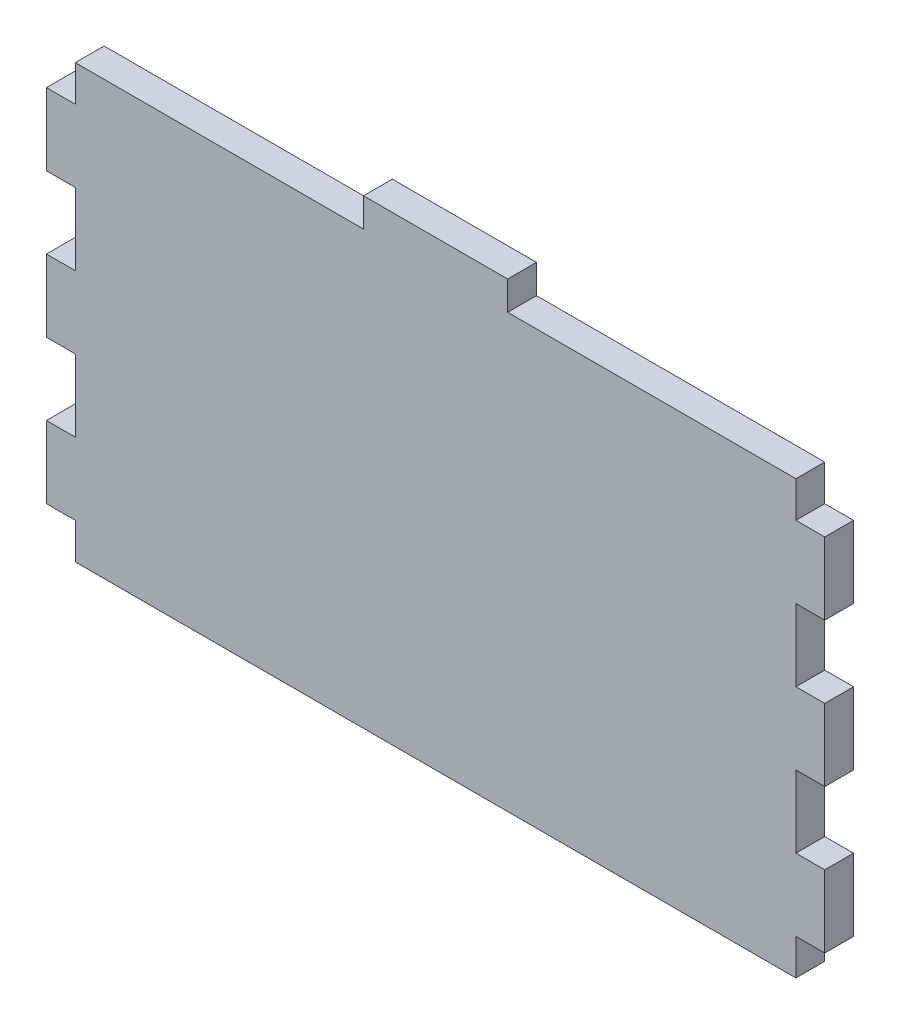
ISO-10303-21;
HEADER;
FILE_DESCRIPTION(('STEP AP214'),'2;1');
FILE_NAME('part.step','',(''),(''),'','','');
FILE_SCHEMA(('AUTOMOTIVE_DESIGN { 1 0 10303 214 1 1 1 1 }'));
ENDSEC;
DATA;
#1=APPLICATION_CONTEXT('core data for automotive mechanical design processes');
#2=APPLICATION_PROTOCOL_DEFINITION('international standard','automotive_design',2000,#1);
#3=PRODUCT_CONTEXT('',#1,'mechanical');
#4=PRODUCT('Part','Part','',(#3));
#5=PRODUCT_RELATED_PRODUCT_CATEGORY('part','',(#4));
#6=PRODUCT_DEFINITION_FORMATION('','',#4);
#7=PRODUCT_DEFINITION_CONTEXT('part definition',#1,'design');
#8=PRODUCT_DEFINITION('design','',#6,#7);
#9=PRODUCT_DEFINITION_SHAPE('','',#8);
#10=(LENGTH_UNIT() NAMED_UNIT(*) SI_UNIT(.MILLI.,.METRE.));
#11=(NAMED_UNIT(*) PLANE_ANGLE_UNIT() SI_UNIT($,.RADIAN.));
#12=(NAMED_UNIT(*) SI_UNIT($,.STERADIAN.) SOLID_ANGLE_UNIT());
#13=UNCERTAINTY_MEASURE_WITH_UNIT(LENGTH_MEASURE(1.E-05),#10,'distance_accuracy_value','');
#14=(GEOMETRIC_REPRESENTATION_CONTEXT(3) GLOBAL_UNCERTAINTY_ASSIGNED_CONTEXT((#13)) GLOBAL_UNIT_ASSIGNED_CONTEXT((#10,
#11,#12)) REPRESENTATION_CONTEXT('',''));
#15=CARTESIAN_POINT('',(0.,0.,0.));
#16=DIRECTION('',(0.,0.,1.));
#17=DIRECTION('',(1.,0.,0.));
#18=AXIS2_PLACEMENT_3D('',#15,#16,#17);
#19=CARTESIAN_POINT('',(0.,30.,4.));
#20=DIRECTION('',(0.,1.,0.));
#21=DIRECTION('',(0.,0.,1.));
#22=AXIS2_PLACEMENT_3D('',#19,#20,#21);
#23=PLANE('',#22);
#24=DIRECTION('',(0.,0.,-1.));
#25=VECTOR('',#24,1.);
#26=CARTESIAN_POINT('',(10.,30.,4.));
#27=LINE('',#26,#25);
#28=CARTESIAN_POINT('',(10.,30.,4.));
#29=VERTEX_POINT('',#28);
#30=CARTESIAN_POINT('',(10.,30.,0.));
#31=VERTEX_POINT('',#30);
#32=EDGE_CURVE('E258',#29,#31,#27,.T.);
#33=ORIENTED_EDGE('',*,*,#32,.F.);
#34=DIRECTION('',(1.,0.,0.));
#35=VECTOR('',#34,1.);
#36=CARTESIAN_POINT('',(0.,30.,4.));
#37=LINE('',#36,#35);
#38=CARTESIAN_POINT('',(50.,30.,4.));
#39=VERTEX_POINT('',#38);
#40=EDGE_CURVE('E343',#29,#39,#37,.T.);
#41=ORIENTED_EDGE('',*,*,#40,.T.);
#42=DIRECTION('',(0.,0.,-1.));
#43=VECTOR('',#42,1.);
#44=CARTESIAN_POINT('',(50.,30.,4.));
#45=LINE('',#44,#43);
#46=CARTESIAN_POINT('',(50.,30.,0.));
#47=VERTEX_POINT('',#46);
#48=EDGE_CURVE('E519',#39,#47,#45,.T.);
#49=ORIENTED_EDGE('',*,*,#48,.T.);
#50=DIRECTION('',(1.,0.,0.));
#51=VECTOR('',#50,1.);
#52=CARTESIAN_POINT('',(0.,30.,0.));
#53=LINE('',#52,#51);
#54=EDGE_CURVE('E65',#31,#47,#53,.T.);
#55=ORIENTED_EDGE('',*,*,#54,.F.);
#56=EDGE_LOOP('',(#33,#41,#49,#55));
#57=FACE_BOUND('',#56,.T.);
#58=ADVANCED_FACE('F41',(#57),#23,.T.);
#59=CARTESIAN_POINT('',(50.,0.,4.));
#60=DIRECTION('',(-1.,0.,0.));
#61=DIRECTION('',(0.,0.,1.));
#62=AXIS2_PLACEMENT_3D('',#59,#60,#61);
#63=PLANE('',#62);
#64=DIRECTION('',(0.,1.,0.));
#65=VECTOR('',#64,1.);
#66=CARTESIAN_POINT('',(50.,0.,0.));
#67=LINE('',#66,#65);
#68=CARTESIAN_POINT('',(50.,-30.,0.));
#69=VERTEX_POINT('',#68);
#70=CARTESIAN_POINT('',(50.,-25.,0.));
#71=VERTEX_POINT('',#70);
#72=EDGE_CURVE('E298',#69,#71,#67,.T.);
#73=ORIENTED_EDGE('',*,*,#72,.T.);
#74=DIRECTION('',(0.,0.,-1.));
#75=VECTOR('',#74,1.);
#76=CARTESIAN_POINT('',(50.,-25.,4.));
#77=LINE('',#76,#75);
#78=CARTESIAN_POINT('',(50.,-25.,4.));
#79=VERTEX_POINT('',#78);
#80=EDGE_CURVE('E11',#79,#71,#77,.T.);
#81=ORIENTED_EDGE('',*,*,#80,.F.);
#82=DIRECTION('',(0.,1.,0.));
#83=VECTOR('',#82,1.);
#84=CARTESIAN_POINT('',(50.,0.,4.));
#85=LINE('',#84,#83);
#86=CARTESIAN_POINT('',(50.,-30.,4.));
#87=VERTEX_POINT('',#86);
#88=EDGE_CURVE('E299',#87,#79,#85,.T.);
#89=ORIENTED_EDGE('',*,*,#88,.F.);
#90=DIRECTION('',(0.,0.,-1.));
#91=VECTOR('',#90,1.);
#92=CARTESIAN_POINT('',(50.,-30.,4.));
#93=LINE('',#92,#91);
#94=EDGE_CURVE('E383',#87,#69,#93,.T.);
#95=ORIENTED_EDGE('',*,*,#94,.T.);
#96=EDGE_LOOP('',(#73,#81,#89,#95));
#97=FACE_BOUND('',#96,.T.);
#98=ADVANCED_FACE('F576',(#97),#63,.F.);
#99=CARTESIAN_POINT('',(0.,-25.,4.));
#100=DIRECTION('',(0.,1.,0.));
#101=DIRECTION('',(0.,0.,1.));
#102=AXIS2_PLACEMENT_3D('',#99,#100,#101);
#103=PLANE('',#102);
#104=DIRECTION('',(1.,0.,0.));
#105=VECTOR('',#104,1.);
#106=CARTESIAN_POINT('',(0.,-25.,0.));
#107=LINE('',#106,#105);
#108=CARTESIAN_POINT('',(54.,-25.,0.));
#109=VERTEX_POINT('',#108);
#110=EDGE_CURVE('E387',#71,#109,#107,.T.);
#111=ORIENTED_EDGE('',*,*,#110,.T.);
#112=DIRECTION('',(0.,0.,-1.));
#113=VECTOR('',#112,1.);
#114=CARTESIAN_POINT('',(54.,-25.,4.));
#115=LINE('',#114,#113);
#116=CARTESIAN_POINT('',(54.,-25.,4.));
#117=VERTEX_POINT('',#116);
#118=EDGE_CURVE('E50',#117,#109,#115,.T.);
#119=ORIENTED_EDGE('',*,*,#118,.F.);
#120=DIRECTION('',(1.,0.,0.));
#121=VECTOR('',#120,1.);
#122=CARTESIAN_POINT('',(0.,-25.,4.));
#123=LINE('',#122,#121);
#124=EDGE_CURVE('E303',#79,#117,#123,.T.);
#125=ORIENTED_EDGE('',*,*,#124,.F.);
#126=ORIENTED_EDGE('',*,*,#80,.T.);
#127=EDGE_LOOP('',(#111,#119,#125,#126));
#128=FACE_BOUND('',#127,.T.);
#129=ADVANCED_FACE('F43',(#128),#103,.F.);
#130=CARTESIAN_POINT('',(54.,0.,4.));
#131=DIRECTION('',(1.,0.,0.));
#132=DIRECTION('',(0.,0.,-1.));
#133=AXIS2_PLACEMENT_3D('',#130,#131,#132);
#134=PLANE('',#133);
#135=DIRECTION('',(0.,-1.,0.));
#136=VECTOR('',#135,1.);
#137=CARTESIAN_POINT('',(54.,0.,0.));
#138=LINE('',#137,#136);
#139=CARTESIAN_POINT('',(54.,-15.,0.));
#140=VERTEX_POINT('',#139);
#141=EDGE_CURVE('E393',#140,#109,#138,.T.);
#142=ORIENTED_EDGE('',*,*,#141,.F.);
#143=DIRECTION('',(0.,0.,-1.));
#144=VECTOR('',#143,1.);
#145=CARTESIAN_POINT('',(54.,-15.,4.));
#146=LINE('',#145,#144);
#147=CARTESIAN_POINT('',(54.,-15.,4.));
#148=VERTEX_POINT('',#147);
#149=EDGE_CURVE('E551',#148,#140,#146,.T.);
#150=ORIENTED_EDGE('',*,*,#149,.F.);
#151=DIRECTION('',(0.,-1.,0.));
#152=VECTOR('',#151,1.);
#153=CARTESIAN_POINT('',(54.,0.,4.));
#154=LINE('',#153,#152);
#155=EDGE_CURVE('E309',#148,#117,#154,.T.);
#156=ORIENTED_EDGE('',*,*,#155,.T.);
#157=ORIENTED_EDGE('',*,*,#118,.T.);
#158=EDGE_LOOP('',(#142,#150,#156,#157));
#159=FACE_BOUND('',#158,.T.);
#160=ADVANCED_FACE('F557',(#159),#134,.T.);
#161=CARTESIAN_POINT('',(0.,-15.,4.));
#162=DIRECTION('',(0.,1.,0.));
#163=DIRECTION('',(0.,0.,1.));
#164=AXIS2_PLACEMENT_3D('',#161,#162,#163);
#165=PLANE('',#164);
#166=DIRECTION('',(1.,0.,0.));
#167=VECTOR('',#166,1.);
#168=CARTESIAN_POINT('',(0.,-15.,0.));
#169=LINE('',#168,#167);
#170=CARTESIAN_POINT('',(50.,-15.,0.));
#171=VERTEX_POINT('',#170);
#172=EDGE_CURVE('E397',#171,#140,#169,.T.);
#173=ORIENTED_EDGE('',*,*,#172,.F.);
#174=DIRECTION('',(0.,0.,-1.));
#175=VECTOR('',#174,1.);
#176=CARTESIAN_POINT('',(50.,-15.,4.));
#177=LINE('',#176,#175);
#178=CARTESIAN_POINT('',(50.,-15.,4.));
#179=VERTEX_POINT('',#178);
#180=EDGE_CURVE('E548',#179,#171,#177,.T.);
#181=ORIENTED_EDGE('',*,*,#180,.F.);
#182=DIRECTION('',(1.,0.,0.));
#183=VECTOR('',#182,1.);
#184=CARTESIAN_POINT('',(0.,-15.,4.));
#185=LINE('',#184,#183);
#186=EDGE_CURVE('E313',#179,#148,#185,.T.);
#187=ORIENTED_EDGE('',*,*,#186,.T.);
#188=ORIENTED_EDGE('',*,*,#149,.T.);
#189=EDGE_LOOP('',(#173,#181,#187,#188));
#190=FACE_BOUND('',#189,.T.);
#191=ADVANCED_FACE('F566',(#190),#165,.T.);
#192=CARTESIAN_POINT('',(50.,-5.,0.));
#193=VERTEX_POINT('',#192);
#194=EDGE_CURVE('E389',#171,#193,#67,.T.);
#195=ORIENTED_EDGE('',*,*,#194,.T.);
#196=DIRECTION('',(0.,0.,-1.));
#197=VECTOR('',#196,1.);
#198=CARTESIAN_POINT('',(50.,-5.,4.));
#199=LINE('',#198,#197);
#200=CARTESIAN_POINT('',(50.,-5.,4.));
#201=VERTEX_POINT('',#200);
#202=EDGE_CURVE('E544',#201,#193,#199,.T.);
#203=ORIENTED_EDGE('',*,*,#202,.F.);
#204=EDGE_CURVE('E306',#179,#201,#85,.T.);
#205=ORIENTED_EDGE('',*,*,#204,.F.);
#206=ORIENTED_EDGE('',*,*,#180,.T.);
#207=EDGE_LOOP('',(#195,#203,#205,#206));
#208=FACE_BOUND('',#207,.T.);
#209=ADVANCED_FACE('F634',(#208),#63,.F.);
#210=CARTESIAN_POINT('',(0.,-5.,4.));
#211=DIRECTION('',(0.,1.,0.));
#212=DIRECTION('',(0.,0.,1.));
#213=AXIS2_PLACEMENT_3D('',#210,#211,#212);
#214=PLANE('',#213);
#215=DIRECTION('',(1.,0.,0.));
#216=VECTOR('',#215,1.);
#217=CARTESIAN_POINT('',(0.,-5.,0.));
#218=LINE('',#217,#216);
#219=CARTESIAN_POINT('',(54.,-5.,0.));
#220=VERTEX_POINT('',#219);
#221=EDGE_CURVE('E401',#193,#220,#218,.T.);
#222=ORIENTED_EDGE('',*,*,#221,.T.);
#223=DIRECTION('',(0.,0.,-1.));
#224=VECTOR('',#223,1.);
#225=CARTESIAN_POINT('',(54.,-5.,4.));
#226=LINE('',#225,#224);
#227=CARTESIAN_POINT('',(54.,-5.,4.));
#228=VERTEX_POINT('',#227);
#229=EDGE_CURVE('E541',#228,#220,#226,.T.);
#230=ORIENTED_EDGE('',*,*,#229,.F.);
#231=DIRECTION('',(1.,0.,0.));
#232=VECTOR('',#231,1.);
#233=CARTESIAN_POINT('',(0.,-5.,4.));
#234=LINE('',#233,#232);
#235=EDGE_CURVE('E317',#201,#228,#234,.T.);
#236=ORIENTED_EDGE('',*,*,#235,.F.);
#237=ORIENTED_EDGE('',*,*,#202,.T.);
#238=EDGE_LOOP('',(#222,#230,#236,#237));
#239=FACE_BOUND('',#238,.T.);
#240=ADVANCED_FACE('F667',(#239),#214,.F.);
#241=CARTESIAN_POINT('',(54.,0.,4.));
#242=DIRECTION('',(1.,0.,0.));
#243=DIRECTION('',(0.,0.,-1.));
#244=AXIS2_PLACEMENT_3D('',#241,#242,#243);
#245=PLANE('',#244);
#246=DIRECTION('',(0.,-1.,0.));
#247=VECTOR('',#246,1.);
#248=CARTESIAN_POINT('',(54.,0.,0.));
#249=LINE('',#248,#247);
#250=CARTESIAN_POINT('',(54.,5.,0.));
#251=VERTEX_POINT('',#250);
#252=EDGE_CURVE('E405',#251,#220,#249,.T.);
#253=ORIENTED_EDGE('',*,*,#252,.F.);
#254=DIRECTION('',(0.,0.,-1.));
#255=VECTOR('',#254,1.);
#256=CARTESIAN_POINT('',(54.,5.,4.));
#257=LINE('',#256,#255);
#258=CARTESIAN_POINT('',(54.,5.,4.));
#259=VERTEX_POINT('',#258);
#260=EDGE_CURVE('E538',#259,#251,#257,.T.);
#261=ORIENTED_EDGE('',*,*,#260,.F.);
#262=DIRECTION('',(0.,-1.,0.));
#263=VECTOR('',#262,1.);
#264=CARTESIAN_POINT('',(54.,0.,4.));
#265=LINE('',#264,#263);
#266=EDGE_CURVE('E320',#259,#228,#265,.T.);
#267=ORIENTED_EDGE('',*,*,#266,.T.);
#268=ORIENTED_EDGE('',*,*,#229,.T.);
#269=EDGE_LOOP('',(#253,#261,#267,#268));
#270=FACE_BOUND('',#269,.T.);
#271=ADVANCED_FACE('F663',(#270),#245,.T.);
#272=CARTESIAN_POINT('',(0.,5.,4.));
#273=DIRECTION('',(0.,1.,0.));
#274=DIRECTION('',(0.,0.,1.));
#275=AXIS2_PLACEMENT_3D('',#272,#273,#274);
#276=PLANE('',#275);
#277=DIRECTION('',(1.,0.,0.));
#278=VECTOR('',#277,1.);
#279=CARTESIAN_POINT('',(0.,5.,0.));
#280=LINE('',#279,#278);
#281=CARTESIAN_POINT('',(50.,5.,0.));
#282=VERTEX_POINT('',#281);
#283=EDGE_CURVE('E409',#282,#251,#280,.T.);
#284=ORIENTED_EDGE('',*,*,#283,.F.);
#285=DIRECTION('',(0.,0.,-1.));
#286=VECTOR('',#285,1.);
#287=CARTESIAN_POINT('',(50.,5.,4.));
#288=LINE('',#287,#286);
#289=CARTESIAN_POINT('',(50.,5.,4.));
#290=VERTEX_POINT('',#289);
#291=EDGE_CURVE('E535',#290,#282,#288,.T.);
#292=ORIENTED_EDGE('',*,*,#291,.F.);
#293=DIRECTION('',(1.,0.,0.));
#294=VECTOR('',#293,1.);
#295=CARTESIAN_POINT('',(0.,5.,4.));
#296=LINE('',#295,#294);
#297=EDGE_CURVE('E324',#290,#259,#296,.T.);
#298=ORIENTED_EDGE('',*,*,#297,.T.);
#299=ORIENTED_EDGE('',*,*,#260,.T.);
#300=EDGE_LOOP('',(#284,#292,#298,#299));
#301=FACE_BOUND('',#300,.T.);
#302=ADVANCED_FACE('F655',(#301),#276,.T.);
#303=CARTESIAN_POINT('',(50.,15.,0.));
#304=VERTEX_POINT('',#303);
#305=EDGE_CURVE('E413',#282,#304,#67,.T.);
#306=ORIENTED_EDGE('',*,*,#305,.T.);
#307=DIRECTION('',(0.,0.,-1.));
#308=VECTOR('',#307,1.);
#309=CARTESIAN_POINT('',(50.,15.,4.));
#310=LINE('',#309,#308);
#311=CARTESIAN_POINT('',(50.,15.,4.));
#312=VERTEX_POINT('',#311);
#313=EDGE_CURVE('E531',#312,#304,#310,.T.);
#314=ORIENTED_EDGE('',*,*,#313,.F.);
#315=EDGE_CURVE('E328',#290,#312,#85,.T.);
#316=ORIENTED_EDGE('',*,*,#315,.F.);
#317=ORIENTED_EDGE('',*,*,#291,.T.);
#318=EDGE_LOOP('',(#306,#314,#316,#317));
#319=FACE_BOUND('',#318,.T.);
#320=ADVANCED_FACE('F645',(#319),#63,.F.);
#321=CARTESIAN_POINT('',(0.,15.,4.));
#322=DIRECTION('',(0.,1.,0.));
#323=DIRECTION('',(-1.,0.,0.));
#324=AXIS2_PLACEMENT_3D('',#321,#322,#323);
#325=PLANE('',#324);
#326=DIRECTION('',(1.,0.,0.));
#327=VECTOR('',#326,1.);
#328=CARTESIAN_POINT('',(0.,15.,0.));
#329=LINE('',#328,#327);
#330=CARTESIAN_POINT('',(54.,15.,0.));
#331=VERTEX_POINT('',#330);
#332=EDGE_CURVE('E414',#304,#331,#329,.T.);
#333=ORIENTED_EDGE('',*,*,#332,.T.);
#334=DIRECTION('',(0.,0.,-1.));
#335=VECTOR('',#334,1.);
#336=CARTESIAN_POINT('',(54.,15.,4.));
#337=LINE('',#336,#335);
#338=CARTESIAN_POINT('',(54.,15.,4.));
#339=VERTEX_POINT('',#338);
#340=EDGE_CURVE('E528',#339,#331,#337,.T.);
#341=ORIENTED_EDGE('',*,*,#340,.F.);
#342=DIRECTION('',(1.,0.,0.));
#343=VECTOR('',#342,1.);
#344=CARTESIAN_POINT('',(0.,15.,4.));
#345=LINE('',#344,#343);
#346=EDGE_CURVE('E329',#312,#339,#345,.T.);
#347=ORIENTED_EDGE('',*,*,#346,.F.);
#348=ORIENTED_EDGE('',*,*,#313,.T.);
#349=EDGE_LOOP('',(#333,#341,#347,#348));
#350=FACE_BOUND('',#349,.T.);
#351=ADVANCED_FACE('F654',(#350),#325,.F.);
#352=CARTESIAN_POINT('',(54.,0.,4.));
#353=DIRECTION('',(1.,0.,0.));
#354=DIRECTION('',(0.,0.,-1.));
#355=AXIS2_PLACEMENT_3D('',#352,#353,#354);
#356=PLANE('',#355);
#357=DIRECTION('',(0.,-1.,0.));
#358=VECTOR('',#357,1.);
#359=CARTESIAN_POINT('',(54.,0.,0.));
#360=LINE('',#359,#358);
#361=CARTESIAN_POINT('',(54.,25.,0.));
#362=VERTEX_POINT('',#361);
#363=EDGE_CURVE('E418',#362,#331,#360,.T.);
#364=ORIENTED_EDGE('',*,*,#363,.F.);
#365=DIRECTION('',(0.,0.,-1.));
#366=VECTOR('',#365,1.);
#367=CARTESIAN_POINT('',(54.,25.,4.));
#368=LINE('',#367,#366);
#369=CARTESIAN_POINT('',(54.,25.,4.));
#370=VERTEX_POINT('',#369);
#371=EDGE_CURVE('E525',#370,#362,#368,.T.);
#372=ORIENTED_EDGE('',*,*,#371,.F.);
#373=DIRECTION('',(0.,-1.,0.));
#374=VECTOR('',#373,1.);
#375=CARTESIAN_POINT('',(54.,0.,4.));
#376=LINE('',#375,#374);
#377=EDGE_CURVE('E332',#370,#339,#376,.T.);
#378=ORIENTED_EDGE('',*,*,#377,.T.);
#379=ORIENTED_EDGE('',*,*,#340,.T.);
#380=EDGE_LOOP('',(#364,#372,#378,#379));
#381=FACE_BOUND('',#380,.T.);
#382=ADVANCED_FACE('F649',(#381),#356,.T.);
#383=CARTESIAN_POINT('',(0.,25.,4.));
#384=DIRECTION('',(0.,1.,0.));
#385=DIRECTION('',(0.,0.,1.));
#386=AXIS2_PLACEMENT_3D('',#383,#384,#385);
#387=PLANE('',#386);
#388=DIRECTION('',(1.,0.,0.));
#389=VECTOR('',#388,1.);
#390=CARTESIAN_POINT('',(0.,25.,0.));
#391=LINE('',#390,#389);
#392=CARTESIAN_POINT('',(50.,25.,0.));
#393=VERTEX_POINT('',#392);
#394=EDGE_CURVE('E422',#393,#362,#391,.T.);
#395=ORIENTED_EDGE('',*,*,#394,.F.);
#396=DIRECTION('',(0.,0.,-1.));
#397=VECTOR('',#396,1.);
#398=CARTESIAN_POINT('',(50.,25.,4.));
#399=LINE('',#398,#397);
#400=CARTESIAN_POINT('',(50.,25.,4.));
#401=VERTEX_POINT('',#400);
#402=EDGE_CURVE('E522',#401,#393,#399,.T.);
#403=ORIENTED_EDGE('',*,*,#402,.F.);
#404=DIRECTION('',(1.,0.,0.));
#405=VECTOR('',#404,1.);
#406=CARTESIAN_POINT('',(0.,25.,4.));
#407=LINE('',#406,#405);
#408=EDGE_CURVE('E336',#401,#370,#407,.T.);
#409=ORIENTED_EDGE('',*,*,#408,.T.);
#410=ORIENTED_EDGE('',*,*,#371,.T.);
#411=EDGE_LOOP('',(#395,#403,#409,#410));
#412=FACE_BOUND('',#411,.T.);
#413=ADVANCED_FACE('F643',(#412),#387,.T.);
#414=EDGE_CURVE('E388',#393,#47,#67,.T.);
#415=ORIENTED_EDGE('',*,*,#414,.T.);
#416=ORIENTED_EDGE('',*,*,#48,.F.);
#417=EDGE_CURVE('E305',#401,#39,#85,.T.);
#418=ORIENTED_EDGE('',*,*,#417,.F.);
#419=ORIENTED_EDGE('',*,*,#402,.T.);
#420=EDGE_LOOP('',(#415,#416,#418,#419));
#421=FACE_BOUND('',#420,.T.);
#422=ADVANCED_FACE('F635',(#421),#63,.F.);
#423=DIRECTION('',(0.,0.,1.));
#424=VECTOR('',#423,1.);
#425=CARTESIAN_POINT('',(-10.,30.,4.));
#426=LINE('',#425,#424);
#427=CARTESIAN_POINT('',(-10.,30.,0.));
#428=VERTEX_POINT('',#427);
#429=CARTESIAN_POINT('',(-10.,30.,4.));
#430=VERTEX_POINT('',#429);
#431=EDGE_CURVE('E292',#428,#430,#426,.T.);
#432=ORIENTED_EDGE('',*,*,#431,.F.);
#433=CARTESIAN_POINT('',(-50.,30.,0.));
#434=VERTEX_POINT('',#433);
#435=EDGE_CURVE('E426',#434,#428,#53,.T.);
#436=ORIENTED_EDGE('',*,*,#435,.F.);
#437=DIRECTION('',(0.,0.,-1.));
#438=VECTOR('',#437,1.);
#439=CARTESIAN_POINT('',(-50.,30.,4.));
#440=LINE('',#439,#438);
#441=CARTESIAN_POINT('',(-50.,30.,4.));
#442=VERTEX_POINT('',#441);
#443=EDGE_CURVE('E516',#442,#434,#440,.T.);
#444=ORIENTED_EDGE('',*,*,#443,.F.);
#445=EDGE_CURVE('E57',#442,#430,#37,.T.);
#446=ORIENTED_EDGE('',*,*,#445,.T.);
#447=EDGE_LOOP('',(#432,#436,#444,#446));
#448=FACE_BOUND('',#447,.T.);
#449=ADVANCED_FACE('F629',(#448),#23,.T.);
#450=CARTESIAN_POINT('',(-50.,0.,4.));
#451=DIRECTION('',(-1.,0.,0.));
#452=DIRECTION('',(0.,0.,1.));
#453=AXIS2_PLACEMENT_3D('',#450,#451,#452);
#454=PLANE('',#453);
#455=DIRECTION('',(0.,1.,0.));
#456=VECTOR('',#455,1.);
#457=CARTESIAN_POINT('',(-50.,0.,0.));
#458=LINE('',#457,#456);
#459=CARTESIAN_POINT('',(-50.,25.,0.));
#460=VERTEX_POINT('',#459);
#461=EDGE_CURVE('E429',#460,#434,#458,.T.);
#462=ORIENTED_EDGE('',*,*,#461,.F.);
#463=DIRECTION('',(0.,0.,-1.));
#464=VECTOR('',#463,1.);
#465=CARTESIAN_POINT('',(-50.,25.,4.));
#466=LINE('',#465,#464);
#467=CARTESIAN_POINT('',(-50.,25.,4.));
#468=VERTEX_POINT('',#467);
#469=EDGE_CURVE('E513',#468,#460,#466,.T.);
#470=ORIENTED_EDGE('',*,*,#469,.F.);
#471=DIRECTION('',(0.,1.,0.));
#472=VECTOR('',#471,1.);
#473=CARTESIAN_POINT('',(-50.,0.,4.));
#474=LINE('',#473,#472);
#475=EDGE_CURVE('E342',#468,#442,#474,.T.);
#476=ORIENTED_EDGE('',*,*,#475,.T.);
#477=ORIENTED_EDGE('',*,*,#443,.T.);
#478=EDGE_LOOP('',(#462,#470,#476,#477));
#479=FACE_BOUND('',#478,.T.);
#480=ADVANCED_FACE('F617',(#479),#454,.T.);
#481=CARTESIAN_POINT('',(0.,25.,4.));
#482=DIRECTION('',(0.,1.,0.));
#483=DIRECTION('',(0.,0.,1.));
#484=AXIS2_PLACEMENT_3D('',#481,#482,#483);
#485=PLANE('',#484);
#486=DIRECTION('',(1.,0.,0.));
#487=VECTOR('',#486,1.);
#488=CARTESIAN_POINT('',(0.,25.,0.));
#489=LINE('',#488,#487);
#490=CARTESIAN_POINT('',(-54.,25.,0.));
#491=VERTEX_POINT('',#490);
#492=EDGE_CURVE('E433',#491,#460,#489,.T.);
#493=ORIENTED_EDGE('',*,*,#492,.F.);
#494=DIRECTION('',(0.,0.,-1.));
#495=VECTOR('',#494,1.);
#496=CARTESIAN_POINT('',(-54.,25.,4.));
#497=LINE('',#496,#495);
#498=CARTESIAN_POINT('',(-54.,25.,4.));
#499=VERTEX_POINT('',#498);
#500=EDGE_CURVE('E510',#499,#491,#497,.T.);
#501=ORIENTED_EDGE('',*,*,#500,.F.);
#502=DIRECTION('',(1.,0.,0.));
#503=VECTOR('',#502,1.);
#504=CARTESIAN_POINT('',(0.,25.,4.));
#505=LINE('',#504,#503);
#506=EDGE_CURVE('E347',#499,#468,#505,.T.);
#507=ORIENTED_EDGE('',*,*,#506,.T.);
#508=ORIENTED_EDGE('',*,*,#469,.T.);
#509=EDGE_LOOP('',(#493,#501,#507,#508));
#510=FACE_BOUND('',#509,.T.);
#511=ADVANCED_FACE('F613',(#510),#485,.T.);
#512=CARTESIAN_POINT('',(-54.,0.,4.));
#513=DIRECTION('',(1.,0.,0.));
#514=DIRECTION('',(0.,0.,-1.));
#515=AXIS2_PLACEMENT_3D('',#512,#513,#514);
#516=PLANE('',#515);
#517=DIRECTION('',(0.,-1.,0.));
#518=VECTOR('',#517,1.);
#519=CARTESIAN_POINT('',(-54.,0.,0.));
#520=LINE('',#519,#518);
#521=CARTESIAN_POINT('',(-54.,15.,0.));
#522=VERTEX_POINT('',#521);
#523=EDGE_CURVE('E439',#491,#522,#520,.T.);
#524=ORIENTED_EDGE('',*,*,#523,.T.);
#525=DIRECTION('',(0.,0.,-1.));
#526=VECTOR('',#525,1.);
#527=CARTESIAN_POINT('',(-54.,15.,4.));
#528=LINE('',#527,#526);
#529=CARTESIAN_POINT('',(-54.,15.,4.));
#530=VERTEX_POINT('',#529);
#531=EDGE_CURVE('E506',#530,#522,#528,.T.);
#532=ORIENTED_EDGE('',*,*,#531,.F.);
#533=DIRECTION('',(0.,-1.,0.));
#534=VECTOR('',#533,1.);
#535=CARTESIAN_POINT('',(-54.,0.,4.));
#536=LINE('',#535,#534);
#537=EDGE_CURVE('E353',#499,#530,#536,.T.);
#538=ORIENTED_EDGE('',*,*,#537,.F.);
#539=ORIENTED_EDGE('',*,*,#500,.T.);
#540=EDGE_LOOP('',(#524,#532,#538,#539));
#541=FACE_BOUND('',#540,.T.);
#542=ADVANCED_FACE('F609',(#541),#516,.F.);
#543=CARTESIAN_POINT('',(0.,15.,4.));
#544=DIRECTION('',(0.,1.,0.));
#545=DIRECTION('',(0.,0.,1.));
#546=AXIS2_PLACEMENT_3D('',#543,#544,#545);
#547=PLANE('',#546);
#548=DIRECTION('',(1.,0.,0.));
#549=VECTOR('',#548,1.);
#550=CARTESIAN_POINT('',(0.,15.,0.));
#551=LINE('',#550,#549);
#552=CARTESIAN_POINT('',(-50.,15.,0.));
#553=VERTEX_POINT('',#552);
#554=EDGE_CURVE('E442',#522,#553,#551,.T.);
#555=ORIENTED_EDGE('',*,*,#554,.T.);
#556=DIRECTION('',(0.,0.,-1.));
#557=VECTOR('',#556,1.);
#558=CARTESIAN_POINT('',(-50.,15.,4.));
#559=LINE('',#558,#557);
#560=CARTESIAN_POINT('',(-50.,15.,4.));
#561=VERTEX_POINT('',#560);
#562=EDGE_CURVE('E503',#561,#553,#559,.T.);
#563=ORIENTED_EDGE('',*,*,#562,.F.);
#564=DIRECTION('',(1.,0.,0.));
#565=VECTOR('',#564,1.);
#566=CARTESIAN_POINT('',(0.,15.,4.));
#567=LINE('',#566,#565);
#568=EDGE_CURVE('E356',#530,#561,#567,.T.);
#569=ORIENTED_EDGE('',*,*,#568,.F.);
#570=ORIENTED_EDGE('',*,*,#531,.T.);
#571=EDGE_LOOP('',(#555,#563,#569,#570));
#572=FACE_BOUND('',#571,.T.);
#573=ADVANCED_FACE('F605',(#572),#547,.F.);
#574=CARTESIAN_POINT('',(-50.,5.,0.));
#575=VERTEX_POINT('',#574);
#576=EDGE_CURVE('E435',#575,#553,#458,.T.);
#577=ORIENTED_EDGE('',*,*,#576,.F.);
#578=DIRECTION('',(0.,0.,-1.));
#579=VECTOR('',#578,1.);
#580=CARTESIAN_POINT('',(-50.,5.,4.));
#581=LINE('',#580,#579);
#582=CARTESIAN_POINT('',(-50.,5.,4.));
#583=VERTEX_POINT('',#582);
#584=EDGE_CURVE('E500',#583,#575,#581,.T.);
#585=ORIENTED_EDGE('',*,*,#584,.F.);
#586=EDGE_CURVE('E349',#583,#561,#474,.T.);
#587=ORIENTED_EDGE('',*,*,#586,.T.);
#588=ORIENTED_EDGE('',*,*,#562,.T.);
#589=EDGE_LOOP('',(#577,#585,#587,#588));
#590=FACE_BOUND('',#589,.T.);
#591=ADVANCED_FACE('F599',(#590),#454,.T.);
#592=CARTESIAN_POINT('',(0.,5.,4.));
#593=DIRECTION('',(0.,1.,0.));
#594=DIRECTION('',(0.,0.,1.));
#595=AXIS2_PLACEMENT_3D('',#592,#593,#594);
#596=PLANE('',#595);
#597=DIRECTION('',(1.,0.,0.));
#598=VECTOR('',#597,1.);
#599=CARTESIAN_POINT('',(0.,5.,0.));
#600=LINE('',#599,#598);
#601=CARTESIAN_POINT('',(-54.,5.,0.));
#602=VERTEX_POINT('',#601);
#603=EDGE_CURVE('E446',#602,#575,#600,.T.);
#604=ORIENTED_EDGE('',*,*,#603,.F.);
#605=DIRECTION('',(0.,0.,-1.));
#606=VECTOR('',#605,1.);
#607=CARTESIAN_POINT('',(-54.,5.,4.));
#608=LINE('',#607,#606);
#609=CARTESIAN_POINT('',(-54.,5.,4.));
#610=VERTEX_POINT('',#609);
#611=EDGE_CURVE('E497',#610,#602,#608,.T.);
#612=ORIENTED_EDGE('',*,*,#611,.F.);
#613=DIRECTION('',(1.,0.,0.));
#614=VECTOR('',#613,1.);
#615=CARTESIAN_POINT('',(0.,5.,4.));
#616=LINE('',#615,#614);
#617=EDGE_CURVE('E359',#610,#583,#616,.T.);
#618=ORIENTED_EDGE('',*,*,#617,.T.);
#619=ORIENTED_EDGE('',*,*,#584,.T.);
#620=EDGE_LOOP('',(#604,#612,#618,#619));
#621=FACE_BOUND('',#620,.T.);
#622=ADVANCED_FACE('F717',(#621),#596,.T.);
#623=CARTESIAN_POINT('',(-54.,0.,4.));
#624=DIRECTION('',(1.,0.,0.));
#625=DIRECTION('',(0.,0.,-1.));
#626=AXIS2_PLACEMENT_3D('',#623,#624,#625);
#627=PLANE('',#626);
#628=DIRECTION('',(0.,-1.,0.));
#629=VECTOR('',#628,1.);
#630=CARTESIAN_POINT('',(-54.,0.,0.));
#631=LINE('',#630,#629);
#632=CARTESIAN_POINT('',(-54.,-5.,0.));
#633=VERTEX_POINT('',#632);
#634=EDGE_CURVE('E450',#602,#633,#631,.T.);
#635=ORIENTED_EDGE('',*,*,#634,.T.);
#636=DIRECTION('',(0.,0.,-1.));
#637=VECTOR('',#636,1.);
#638=CARTESIAN_POINT('',(-54.,-5.,4.));
#639=LINE('',#638,#637);
#640=CARTESIAN_POINT('',(-54.,-5.,4.));
#641=VERTEX_POINT('',#640);
#642=EDGE_CURVE('E493',#641,#633,#639,.T.);
#643=ORIENTED_EDGE('',*,*,#642,.F.);
#644=DIRECTION('',(0.,-1.,0.));
#645=VECTOR('',#644,1.);
#646=CARTESIAN_POINT('',(-54.,0.,4.));
#647=LINE('',#646,#645);
#648=EDGE_CURVE('E363',#610,#641,#647,.T.);
#649=ORIENTED_EDGE('',*,*,#648,.F.);
#650=ORIENTED_EDGE('',*,*,#611,.T.);
#651=EDGE_LOOP('',(#635,#643,#649,#650));
#652=FACE_BOUND('',#651,.T.);
#653=ADVANCED_FACE('F720',(#652),#627,.F.);
#654=CARTESIAN_POINT('',(0.,-5.,4.));
#655=DIRECTION('',(0.,1.,0.));
#656=DIRECTION('',(0.,0.,1.));
#657=AXIS2_PLACEMENT_3D('',#654,#655,#656);
#658=PLANE('',#657);
#659=DIRECTION('',(1.,0.,0.));
#660=VECTOR('',#659,1.);
#661=CARTESIAN_POINT('',(0.,-5.,0.));
#662=LINE('',#661,#660);
#663=CARTESIAN_POINT('',(-50.,-5.,0.));
#664=VERTEX_POINT('',#663);
#665=EDGE_CURVE('E453',#633,#664,#662,.T.);
#666=ORIENTED_EDGE('',*,*,#665,.T.);
#667=DIRECTION('',(0.,0.,-1.));
#668=VECTOR('',#667,1.);
#669=CARTESIAN_POINT('',(-50.,-5.,4.));
#670=LINE('',#669,#668);
#671=CARTESIAN_POINT('',(-50.,-5.,4.));
#672=VERTEX_POINT('',#671);
#673=EDGE_CURVE('E490',#672,#664,#670,.T.);
#674=ORIENTED_EDGE('',*,*,#673,.F.);
#675=DIRECTION('',(1.,0.,0.));
#676=VECTOR('',#675,1.);
#677=CARTESIAN_POINT('',(0.,-5.,4.));
#678=LINE('',#677,#676);
#679=EDGE_CURVE('E366',#641,#672,#678,.T.);
#680=ORIENTED_EDGE('',*,*,#679,.F.);
#681=ORIENTED_EDGE('',*,*,#642,.T.);
#682=EDGE_LOOP('',(#666,#674,#680,#681));
#683=FACE_BOUND('',#682,.T.);
#684=ADVANCED_FACE('F713',(#683),#658,.F.);
#685=CARTESIAN_POINT('',(-50.,-15.,0.));
#686=VERTEX_POINT('',#685);
#687=EDGE_CURVE('E457',#686,#664,#458,.T.);
#688=ORIENTED_EDGE('',*,*,#687,.F.);
#689=DIRECTION('',(0.,0.,-1.));
#690=VECTOR('',#689,1.);
#691=CARTESIAN_POINT('',(-50.,-15.,4.));
#692=LINE('',#691,#690);
#693=CARTESIAN_POINT('',(-50.,-15.,4.));
#694=VERTEX_POINT('',#693);
#695=EDGE_CURVE('E487',#694,#686,#692,.T.);
#696=ORIENTED_EDGE('',*,*,#695,.F.);
#697=EDGE_CURVE('E369',#694,#672,#474,.T.);
#698=ORIENTED_EDGE('',*,*,#697,.T.);
#699=ORIENTED_EDGE('',*,*,#673,.T.);
#700=EDGE_LOOP('',(#688,#696,#698,#699));
#701=FACE_BOUND('',#700,.T.);
#702=ADVANCED_FACE('F709',(#701),#454,.T.);
#703=CARTESIAN_POINT('',(0.,-15.,4.));
#704=DIRECTION('',(0.,1.,0.));
#705=DIRECTION('',(0.,0.,1.));
#706=AXIS2_PLACEMENT_3D('',#703,#704,#705);
#707=PLANE('',#706);
#708=DIRECTION('',(1.,0.,0.));
#709=VECTOR('',#708,1.);
#710=CARTESIAN_POINT('',(0.,-15.,0.));
#711=LINE('',#710,#709);
#712=CARTESIAN_POINT('',(-54.,-15.,0.));
#713=VERTEX_POINT('',#712);
#714=EDGE_CURVE('E458',#713,#686,#711,.T.);
#715=ORIENTED_EDGE('',*,*,#714,.F.);
#716=DIRECTION('',(0.,0.,-1.));
#717=VECTOR('',#716,1.);
#718=CARTESIAN_POINT('',(-54.,-15.,4.));
#719=LINE('',#718,#717);
#720=CARTESIAN_POINT('',(-54.,-15.,4.));
#721=VERTEX_POINT('',#720);
#722=EDGE_CURVE('E484',#721,#713,#719,.T.);
#723=ORIENTED_EDGE('',*,*,#722,.F.);
#724=DIRECTION('',(1.,0.,0.));
#725=VECTOR('',#724,1.);
#726=CARTESIAN_POINT('',(0.,-15.,4.));
#727=LINE('',#726,#725);
#728=EDGE_CURVE('E370',#721,#694,#727,.T.);
#729=ORIENTED_EDGE('',*,*,#728,.T.);
#730=ORIENTED_EDGE('',*,*,#695,.T.);
#731=EDGE_LOOP('',(#715,#723,#729,#730));
#732=FACE_BOUND('',#731,.T.);
#733=ADVANCED_FACE('F706',(#732),#707,.T.);
#734=CARTESIAN_POINT('',(-54.,0.,4.));
#735=DIRECTION('',(1.,0.,0.));
#736=DIRECTION('',(0.,0.,-1.));
#737=AXIS2_PLACEMENT_3D('',#734,#735,#736);
#738=PLANE('',#737);
#739=DIRECTION('',(0.,-1.,0.));
#740=VECTOR('',#739,1.);
#741=CARTESIAN_POINT('',(-54.,0.,0.));
#742=LINE('',#741,#740);
#743=CARTESIAN_POINT('',(-54.,-25.,0.));
#744=VERTEX_POINT('',#743);
#745=EDGE_CURVE('E462',#713,#744,#742,.T.);
#746=ORIENTED_EDGE('',*,*,#745,.T.);
#747=DIRECTION('',(0.,0.,-1.));
#748=VECTOR('',#747,1.);
#749=CARTESIAN_POINT('',(-54.,-25.,4.));
#750=LINE('',#749,#748);
#751=CARTESIAN_POINT('',(-54.,-25.,4.));
#752=VERTEX_POINT('',#751);
#753=EDGE_CURVE('E480',#752,#744,#750,.T.);
#754=ORIENTED_EDGE('',*,*,#753,.F.);
#755=DIRECTION('',(0.,-1.,0.));
#756=VECTOR('',#755,1.);
#757=CARTESIAN_POINT('',(-54.,0.,4.));
#758=LINE('',#757,#756);
#759=EDGE_CURVE('E374',#721,#752,#758,.T.);
#760=ORIENTED_EDGE('',*,*,#759,.F.);
#761=ORIENTED_EDGE('',*,*,#722,.T.);
#762=EDGE_LOOP('',(#746,#754,#760,#761));
#763=FACE_BOUND('',#762,.T.);
#764=ADVANCED_FACE('F784',(#763),#738,.F.);
#765=CARTESIAN_POINT('',(0.,-25.,4.));
#766=DIRECTION('',(0.,1.,0.));
#767=DIRECTION('',(0.,0.,1.));
#768=AXIS2_PLACEMENT_3D('',#765,#766,#767);
#769=PLANE('',#768);
#770=DIRECTION('',(1.,0.,0.));
#771=VECTOR('',#770,1.);
#772=CARTESIAN_POINT('',(0.,-25.,0.));
#773=LINE('',#772,#771);
#774=CARTESIAN_POINT('',(-50.,-25.,0.));
#775=VERTEX_POINT('',#774);
#776=EDGE_CURVE('E465',#744,#775,#773,.T.);
#777=ORIENTED_EDGE('',*,*,#776,.T.);
#778=DIRECTION('',(0.,0.,-1.));
#779=VECTOR('',#778,1.);
#780=CARTESIAN_POINT('',(-50.,-25.,4.));
#781=LINE('',#780,#779);
#782=CARTESIAN_POINT('',(-50.,-25.,4.));
#783=VERTEX_POINT('',#782);
#784=EDGE_CURVE('E477',#783,#775,#781,.T.);
#785=ORIENTED_EDGE('',*,*,#784,.F.);
#786=DIRECTION('',(1.,0.,0.));
#787=VECTOR('',#786,1.);
#788=CARTESIAN_POINT('',(0.,-25.,4.));
#789=LINE('',#788,#787);
#790=EDGE_CURVE('E377',#752,#783,#789,.T.);
#791=ORIENTED_EDGE('',*,*,#790,.F.);
#792=ORIENTED_EDGE('',*,*,#753,.T.);
#793=EDGE_LOOP('',(#777,#785,#791,#792));
#794=FACE_BOUND('',#793,.T.);
#795=ADVANCED_FACE('F701',(#794),#769,.F.);
#796=CARTESIAN_POINT('',(-50.,-30.,0.));
#797=VERTEX_POINT('',#796);
#798=EDGE_CURVE('E434',#797,#775,#458,.T.);
#799=ORIENTED_EDGE('',*,*,#798,.F.);
#800=DIRECTION('',(0.,0.,-1.));
#801=VECTOR('',#800,1.);
#802=CARTESIAN_POINT('',(-50.,-30.,4.));
#803=LINE('',#802,#801);
#804=CARTESIAN_POINT('',(-50.,-30.,4.));
#805=VERTEX_POINT('',#804);
#806=EDGE_CURVE('E474',#805,#797,#803,.T.);
#807=ORIENTED_EDGE('',*,*,#806,.F.);
#808=EDGE_CURVE('E348',#805,#783,#474,.T.);
#809=ORIENTED_EDGE('',*,*,#808,.T.);
#810=ORIENTED_EDGE('',*,*,#784,.T.);
#811=EDGE_LOOP('',(#799,#807,#809,#810));
#812=FACE_BOUND('',#811,.T.);
#813=ADVANCED_FACE('F583',(#812),#454,.T.);
#814=CARTESIAN_POINT('',(0.,-30.,4.));
#815=DIRECTION('',(0.,1.,0.));
#816=DIRECTION('',(0.,0.,1.));
#817=AXIS2_PLACEMENT_3D('',#814,#815,#816);
#818=PLANE('',#817);
#819=DIRECTION('',(1.,0.,0.));
#820=VECTOR('',#819,1.);
#821=CARTESIAN_POINT('',(0.,-30.,0.));
#822=LINE('',#821,#820);
#823=EDGE_CURVE('E304',#797,#69,#822,.T.);
#824=ORIENTED_EDGE('',*,*,#823,.T.);
#825=ORIENTED_EDGE('',*,*,#94,.F.);
#826=DIRECTION('',(1.,0.,0.));
#827=VECTOR('',#826,1.);
#828=CARTESIAN_POINT('',(0.,-30.,4.));
#829=LINE('',#828,#827);
#830=EDGE_CURVE('E380',#805,#87,#829,.T.);
#831=ORIENTED_EDGE('',*,*,#830,.F.);
#832=ORIENTED_EDGE('',*,*,#806,.T.);
#833=EDGE_LOOP('',(#824,#825,#831,#832));
#834=FACE_BOUND('',#833,.T.);
#835=ADVANCED_FACE('F809',(#834),#818,.F.);
#836=CARTESIAN_POINT('',(0.,0.,4.));
#837=DIRECTION('',(0.,0.,1.));
#838=DIRECTION('',(1.,0.,0.));
#839=AXIS2_PLACEMENT_3D('',#836,#837,#838);
#840=PLANE('',#839);
#841=ORIENTED_EDGE('',*,*,#40,.F.);
#842=DIRECTION('',(0.,1.,0.));
#843=VECTOR('',#842,1.);
#844=CARTESIAN_POINT('',(10.,26.,4.));
#845=LINE('',#844,#843);
#846=CARTESIAN_POINT('',(10.,34.,4.));
#847=VERTEX_POINT('',#846);
#848=EDGE_CURVE('E283',#29,#847,#845,.T.);
#849=ORIENTED_EDGE('',*,*,#848,.T.);
#850=DIRECTION('',(-1.,0.,0.));
#851=VECTOR('',#850,1.);
#852=CARTESIAN_POINT('',(-10.,34.,4.));
#853=LINE('',#852,#851);
#854=CARTESIAN_POINT('',(-10.,34.,4.));
#855=VERTEX_POINT('',#854);
#856=EDGE_CURVE('E269',#847,#855,#853,.T.);
#857=ORIENTED_EDGE('',*,*,#856,.T.);
#858=DIRECTION('',(0.,-1.,0.));
#859=VECTOR('',#858,1.);
#860=CARTESIAN_POINT('',(-10.,26.,4.));
#861=LINE('',#860,#859);
#862=EDGE_CURVE('E263',#855,#430,#861,.T.);
#863=ORIENTED_EDGE('',*,*,#862,.T.);
#864=ORIENTED_EDGE('',*,*,#445,.F.);
#865=ORIENTED_EDGE('',*,*,#475,.F.);
#866=ORIENTED_EDGE('',*,*,#506,.F.);
#867=ORIENTED_EDGE('',*,*,#537,.T.);
#868=ORIENTED_EDGE('',*,*,#568,.T.);
#869=ORIENTED_EDGE('',*,*,#586,.F.);
#870=ORIENTED_EDGE('',*,*,#617,.F.);
#871=ORIENTED_EDGE('',*,*,#648,.T.);
#872=ORIENTED_EDGE('',*,*,#679,.T.);
#873=ORIENTED_EDGE('',*,*,#697,.F.);
#874=ORIENTED_EDGE('',*,*,#728,.F.);
#875=ORIENTED_EDGE('',*,*,#759,.T.);
#876=ORIENTED_EDGE('',*,*,#790,.T.);
#877=ORIENTED_EDGE('',*,*,#808,.F.);
#878=ORIENTED_EDGE('',*,*,#830,.T.);
#879=ORIENTED_EDGE('',*,*,#88,.T.);
#880=ORIENTED_EDGE('',*,*,#124,.T.);
#881=ORIENTED_EDGE('',*,*,#155,.F.);
#882=ORIENTED_EDGE('',*,*,#186,.F.);
#883=ORIENTED_EDGE('',*,*,#204,.T.);
#884=ORIENTED_EDGE('',*,*,#235,.T.);
#885=ORIENTED_EDGE('',*,*,#266,.F.);
#886=ORIENTED_EDGE('',*,*,#297,.F.);
#887=ORIENTED_EDGE('',*,*,#315,.T.);
#888=ORIENTED_EDGE('',*,*,#346,.T.);
#889=ORIENTED_EDGE('',*,*,#377,.F.);
#890=ORIENTED_EDGE('',*,*,#408,.F.);
#891=ORIENTED_EDGE('',*,*,#417,.T.);
#892=EDGE_LOOP('',(#841,#849,#857,#863,#864,#865,#866,#867,#868,#869,#870,#871,#872,#873,#874,
#875,#876,#877,#878,#879,#880,#881,#882,#883,#884,#885,#886,#887,#888,#889,#890,#891));
#893=FACE_BOUND('',#892,.T.);
#894=ADVANCED_FACE('F570',(#893),#840,.T.);
#895=CARTESIAN_POINT('',(0.,0.,0.));
#896=DIRECTION('',(0.,0.,1.));
#897=DIRECTION('',(1.,0.,0.));
#898=AXIS2_PLACEMENT_3D('',#895,#896,#897);
#899=PLANE('',#898);
#900=ORIENTED_EDGE('',*,*,#435,.T.);
#901=DIRECTION('',(0.,-1.,0.));
#902=VECTOR('',#901,1.);
#903=CARTESIAN_POINT('',(-10.,26.,0.));
#904=LINE('',#903,#902);
#905=CARTESIAN_POINT('',(-10.,34.,0.));
#906=VERTEX_POINT('',#905);
#907=EDGE_CURVE('E272',#906,#428,#904,.T.);
#908=ORIENTED_EDGE('',*,*,#907,.F.);
#909=DIRECTION('',(-1.,0.,0.));
#910=VECTOR('',#909,1.);
#911=CARTESIAN_POINT('',(-10.,34.,0.));
#912=LINE('',#911,#910);
#913=CARTESIAN_POINT('',(10.,34.,0.));
#914=VERTEX_POINT('',#913);
#915=EDGE_CURVE('E262',#914,#906,#912,.T.);
#916=ORIENTED_EDGE('',*,*,#915,.F.);
#917=DIRECTION('',(0.,1.,0.));
#918=VECTOR('',#917,1.);
#919=CARTESIAN_POINT('',(10.,26.,0.));
#920=LINE('',#919,#918);
#921=EDGE_CURVE('E252',#31,#914,#920,.T.);
#922=ORIENTED_EDGE('',*,*,#921,.F.);
#923=ORIENTED_EDGE('',*,*,#54,.T.);
#924=ORIENTED_EDGE('',*,*,#414,.F.);
#925=ORIENTED_EDGE('',*,*,#394,.T.);
#926=ORIENTED_EDGE('',*,*,#363,.T.);
#927=ORIENTED_EDGE('',*,*,#332,.F.);
#928=ORIENTED_EDGE('',*,*,#305,.F.);
#929=ORIENTED_EDGE('',*,*,#283,.T.);
#930=ORIENTED_EDGE('',*,*,#252,.T.);
#931=ORIENTED_EDGE('',*,*,#221,.F.);
#932=ORIENTED_EDGE('',*,*,#194,.F.);
#933=ORIENTED_EDGE('',*,*,#172,.T.);
#934=ORIENTED_EDGE('',*,*,#141,.T.);
#935=ORIENTED_EDGE('',*,*,#110,.F.);
#936=ORIENTED_EDGE('',*,*,#72,.F.);
#937=ORIENTED_EDGE('',*,*,#823,.F.);
#938=ORIENTED_EDGE('',*,*,#798,.T.);
#939=ORIENTED_EDGE('',*,*,#776,.F.);
#940=ORIENTED_EDGE('',*,*,#745,.F.);
#941=ORIENTED_EDGE('',*,*,#714,.T.);
#942=ORIENTED_EDGE('',*,*,#687,.T.);
#943=ORIENTED_EDGE('',*,*,#665,.F.);
#944=ORIENTED_EDGE('',*,*,#634,.F.);
#945=ORIENTED_EDGE('',*,*,#603,.T.);
#946=ORIENTED_EDGE('',*,*,#576,.T.);
#947=ORIENTED_EDGE('',*,*,#554,.F.);
#948=ORIENTED_EDGE('',*,*,#523,.F.);
#949=ORIENTED_EDGE('',*,*,#492,.T.);
#950=ORIENTED_EDGE('',*,*,#461,.T.);
#951=EDGE_LOOP('',(#900,#908,#916,#922,#923,#924,#925,#926,#927,#928,#929,#930,#931,#932,#933,
#934,#935,#936,#937,#938,#939,#940,#941,#942,#943,#944,#945,#946,#947,#948,#949,#950));
#952=FACE_BOUND('',#951,.T.);
#953=ADVANCED_FACE('F276',(#952),#899,.F.);
#954=CARTESIAN_POINT('',(10.,26.,0.));
#955=DIRECTION('',(1.,0.,0.));
#956=DIRECTION('',(0.,0.,-1.));
#957=AXIS2_PLACEMENT_3D('',#954,#955,#956);
#958=PLANE('',#957);
#959=ORIENTED_EDGE('',*,*,#848,.F.);
#960=ORIENTED_EDGE('',*,*,#32,.T.);
#961=ORIENTED_EDGE('',*,*,#921,.T.);
#962=DIRECTION('',(0.,0.,1.));
#963=VECTOR('',#962,1.);
#964=CARTESIAN_POINT('',(10.,34.,0.));
#965=LINE('',#964,#963);
#966=EDGE_CURVE('E256',#914,#847,#965,.T.);
#967=ORIENTED_EDGE('',*,*,#966,.T.);
#968=EDGE_LOOP('',(#959,#960,#961,#967));
#969=FACE_BOUND('',#968,.T.);
#970=ADVANCED_FACE('F255',(#969),#958,.T.);
#971=CARTESIAN_POINT('',(-10.,26.,0.));
#972=DIRECTION('',(-1.,0.,0.));
#973=DIRECTION('',(0.,0.,1.));
#974=AXIS2_PLACEMENT_3D('',#971,#972,#973);
#975=PLANE('',#974);
#976=ORIENTED_EDGE('',*,*,#907,.T.);
#977=ORIENTED_EDGE('',*,*,#431,.T.);
#978=ORIENTED_EDGE('',*,*,#862,.F.);
#979=DIRECTION('',(0.,0.,1.));
#980=VECTOR('',#979,1.);
#981=CARTESIAN_POINT('',(-10.,34.,0.));
#982=LINE('',#981,#980);
#983=EDGE_CURVE('E271',#906,#855,#982,.T.);
#984=ORIENTED_EDGE('',*,*,#983,.F.);
#985=EDGE_LOOP('',(#976,#977,#978,#984));
#986=FACE_BOUND('',#985,.T.);
#987=ADVANCED_FACE('F620',(#986),#975,.T.);
#988=CARTESIAN_POINT('',(-10.,34.,0.));
#989=DIRECTION('',(0.,1.,0.));
#990=DIRECTION('',(0.,0.,1.));
#991=AXIS2_PLACEMENT_3D('',#988,#989,#990);
#992=PLANE('',#991);
#993=ORIENTED_EDGE('',*,*,#856,.F.);
#994=ORIENTED_EDGE('',*,*,#966,.F.);
#995=ORIENTED_EDGE('',*,*,#915,.T.);
#996=ORIENTED_EDGE('',*,*,#983,.T.);
#997=EDGE_LOOP('',(#993,#994,#995,#996));
#998=FACE_BOUND('',#997,.T.);
#999=ADVANCED_FACE('F267',(#998),#992,.T.);
#1000=CLOSED_SHELL('',(#58,#98,#129,#160,#191,#209,#240,#271,#302,#320,#351,#382,#413,#422,#449,
#480,#511,#542,#573,#591,#622,#653,#684,#702,#733,#764,#795,#813,#835,#894,#953,#970,#987,#999));
#1001=MANIFOLD_SOLID_BREP('B2',#1000);
#1002=ADVANCED_BREP_SHAPE_REPRESENTATION('',(#18,#1001),#14);
#1003=SHAPE_DEFINITION_REPRESENTATION(#9,#1002);
ENDSEC;
END-ISO-10303-21;
